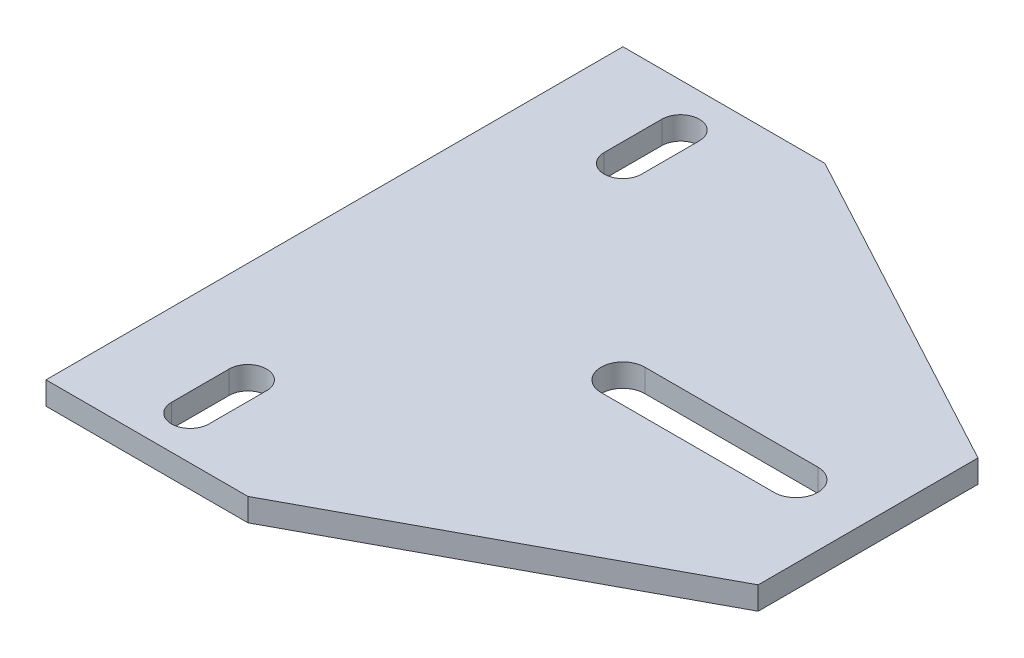
ISO-10303-21;
HEADER;
FILE_DESCRIPTION(('STEP AP214'),'2;1');
FILE_NAME('part.step','',(''),(''),'','','');
FILE_SCHEMA(('AUTOMOTIVE_DESIGN { 1 0 10303 214 1 1 1 1 }'));
ENDSEC;
DATA;
#1=APPLICATION_CONTEXT('core data for automotive mechanical design processes');
#2=APPLICATION_PROTOCOL_DEFINITION('international standard','automotive_design',2000,#1);
#3=PRODUCT_CONTEXT('',#1,'mechanical');
#4=PRODUCT('Part','Part','',(#3));
#5=PRODUCT_RELATED_PRODUCT_CATEGORY('part','',(#4));
#6=PRODUCT_DEFINITION_FORMATION('','',#4);
#7=PRODUCT_DEFINITION_CONTEXT('part definition',#1,'design');
#8=PRODUCT_DEFINITION('design','',#6,#7);
#9=PRODUCT_DEFINITION_SHAPE('','',#8);
#10=(LENGTH_UNIT() NAMED_UNIT(*) SI_UNIT(.MILLI.,.METRE.));
#11=(NAMED_UNIT(*) PLANE_ANGLE_UNIT() SI_UNIT($,.RADIAN.));
#12=(NAMED_UNIT(*) SI_UNIT($,.STERADIAN.) SOLID_ANGLE_UNIT());
#13=UNCERTAINTY_MEASURE_WITH_UNIT(LENGTH_MEASURE(1.E-05),#10,'distance_accuracy_value','');
#14=(GEOMETRIC_REPRESENTATION_CONTEXT(3) GLOBAL_UNCERTAINTY_ASSIGNED_CONTEXT((#13)) GLOBAL_UNIT_ASSIGNED_CONTEXT((#10,
#11,#12)) REPRESENTATION_CONTEXT('',''));
#15=CARTESIAN_POINT('',(0.,0.,0.));
#16=DIRECTION('',(0.,0.,1.));
#17=DIRECTION('',(1.,0.,0.));
#18=AXIS2_PLACEMENT_3D('',#15,#16,#17);
#19=CARTESIAN_POINT('',(41.5,7.9375,0.));
#20=DIRECTION('',(1.,0.,0.));
#21=DIRECTION('',(0.,0.,-1.));
#22=AXIS2_PLACEMENT_3D('',#19,#20,#21);
#23=PLANE('',#22);
#24=DIRECTION('',(0.,0.,1.));
#25=VECTOR('',#24,1.);
#26=CARTESIAN_POINT('',(41.5,0.,0.));
#27=LINE('',#26,#25);
#28=CARTESIAN_POINT('',(41.5,0.,-85.));
#29=VERTEX_POINT('',#28);
#30=CARTESIAN_POINT('',(41.5,0.,-65.));
#31=VERTEX_POINT('',#30);
#32=EDGE_CURVE('E231',#29,#31,#27,.T.);
#33=ORIENTED_EDGE('',*,*,#32,.T.);
#34=DIRECTION('',(0.,-1.,0.));
#35=VECTOR('',#34,1.);
#36=CARTESIAN_POINT('',(41.5,7.9375,-65.));
#37=LINE('',#36,#35);
#38=CARTESIAN_POINT('',(41.5,7.9375,-65.));
#39=VERTEX_POINT('',#38);
#40=EDGE_CURVE('E11',#39,#31,#37,.T.);
#41=ORIENTED_EDGE('',*,*,#40,.F.);
#42=DIRECTION('',(0.,0.,1.));
#43=VECTOR('',#42,1.);
#44=CARTESIAN_POINT('',(41.5,7.9375,0.));
#45=LINE('',#44,#43);
#46=CARTESIAN_POINT('',(41.5,7.9375,-85.));
#47=VERTEX_POINT('',#46);
#48=EDGE_CURVE('E172',#47,#39,#45,.T.);
#49=ORIENTED_EDGE('',*,*,#48,.F.);
#50=DIRECTION('',(0.,-1.,0.));
#51=VECTOR('',#50,1.);
#52=CARTESIAN_POINT('',(41.5,7.9375,-85.));
#53=LINE('',#52,#51);
#54=EDGE_CURVE('E239',#47,#29,#53,.T.);
#55=ORIENTED_EDGE('',*,*,#54,.T.);
#56=EDGE_LOOP('',(#33,#41,#49,#55));
#57=FACE_BOUND('',#56,.T.);
#58=ADVANCED_FACE('F35',(#57),#23,.F.);
#59=CARTESIAN_POINT('',(35.,7.9375,-65.));
#60=DIRECTION('',(0.,-1.,0.));
#61=DIRECTION('',(0.,0.,-1.));
#62=AXIS2_PLACEMENT_3D('',#59,#60,#61);
#63=CYLINDRICAL_SURFACE('',#62,6.49999999999997);
#64=CARTESIAN_POINT('',(35.,0.,-65.));
#65=DIRECTION('',(0.,1.,0.));
#66=DIRECTION('',(0.,0.,1.));
#67=AXIS2_PLACEMENT_3D('',#64,#65,#66);
#68=CIRCLE('',#67,6.49999999999997);
#69=CARTESIAN_POINT('',(28.5,0.,-65.));
#70=VERTEX_POINT('',#69);
#71=EDGE_CURVE('E178',#31,#70,#68,.F.);
#72=ORIENTED_EDGE('',*,*,#71,.T.);
#73=DIRECTION('',(0.,-1.,0.));
#74=VECTOR('',#73,1.);
#75=CARTESIAN_POINT('',(28.5,7.9375,-65.));
#76=LINE('',#75,#74);
#77=CARTESIAN_POINT('',(28.5,7.9375,-65.));
#78=VERTEX_POINT('',#77);
#79=EDGE_CURVE('E45',#78,#70,#76,.T.);
#80=ORIENTED_EDGE('',*,*,#79,.F.);
#81=CARTESIAN_POINT('',(35.,7.9375,-65.));
#82=DIRECTION('',(0.,1.,0.));
#83=DIRECTION('',(0.,0.,1.));
#84=AXIS2_PLACEMENT_3D('',#81,#82,#83);
#85=CIRCLE('',#84,6.49999999999997);
#86=EDGE_CURVE('E166',#39,#78,#85,.F.);
#87=ORIENTED_EDGE('',*,*,#86,.F.);
#88=ORIENTED_EDGE('',*,*,#40,.T.);
#89=EDGE_LOOP('',(#72,#80,#87,#88));
#90=FACE_BOUND('',#89,.T.);
#91=ADVANCED_FACE('F177',(#90),#63,.F.);
#92=CARTESIAN_POINT('',(28.5,7.9375,0.));
#93=DIRECTION('',(1.,0.,0.));
#94=DIRECTION('',(0.,0.,-1.));
#95=AXIS2_PLACEMENT_3D('',#92,#93,#94);
#96=PLANE('',#95);
#97=DIRECTION('',(0.,0.,1.));
#98=VECTOR('',#97,1.);
#99=CARTESIAN_POINT('',(28.5,0.,0.));
#100=LINE('',#99,#98);
#101=CARTESIAN_POINT('',(28.5,0.,-85.));
#102=VERTEX_POINT('',#101);
#103=EDGE_CURVE('E235',#102,#70,#100,.T.);
#104=ORIENTED_EDGE('',*,*,#103,.F.);
#105=DIRECTION('',(0.,-1.,0.));
#106=VECTOR('',#105,1.);
#107=CARTESIAN_POINT('',(28.5,7.9375,-85.));
#108=LINE('',#107,#106);
#109=CARTESIAN_POINT('',(28.5,7.9375,-85.));
#110=VERTEX_POINT('',#109);
#111=EDGE_CURVE('E112',#110,#102,#108,.T.);
#112=ORIENTED_EDGE('',*,*,#111,.F.);
#113=DIRECTION('',(0.,0.,1.));
#114=VECTOR('',#113,1.);
#115=CARTESIAN_POINT('',(28.5,7.9375,0.));
#116=LINE('',#115,#114);
#117=EDGE_CURVE('E170',#110,#78,#116,.T.);
#118=ORIENTED_EDGE('',*,*,#117,.T.);
#119=ORIENTED_EDGE('',*,*,#79,.T.);
#120=EDGE_LOOP('',(#104,#112,#118,#119));
#121=FACE_BOUND('',#120,.T.);
#122=ADVANCED_FACE('F183',(#121),#96,.T.);
#123=CARTESIAN_POINT('',(0.,7.9375,100.));
#124=DIRECTION('',(0.,0.,1.));
#125=DIRECTION('',(1.,0.,0.));
#126=AXIS2_PLACEMENT_3D('',#123,#124,#125);
#127=PLANE('',#126);
#128=DIRECTION('',(-1.,0.,0.));
#129=VECTOR('',#128,1.);
#130=CARTESIAN_POINT('',(0.,0.,100.));
#131=LINE('',#130,#129);
#132=CARTESIAN_POINT('',(70.,0.,100.));
#133=VERTEX_POINT('',#132);
#134=CARTESIAN_POINT('',(0.,0.,100.));
#135=VERTEX_POINT('',#134);
#136=EDGE_CURVE('E213',#133,#135,#131,.T.);
#137=ORIENTED_EDGE('',*,*,#136,.F.);
#138=DIRECTION('',(0.,-1.,0.));
#139=VECTOR('',#138,1.);
#140=CARTESIAN_POINT('',(70.,7.9375,100.));
#141=LINE('',#140,#139);
#142=CARTESIAN_POINT('',(70.,7.9375,100.));
#143=VERTEX_POINT('',#142);
#144=EDGE_CURVE('E241',#143,#133,#141,.T.);
#145=ORIENTED_EDGE('',*,*,#144,.F.);
#146=DIRECTION('',(-1.,0.,0.));
#147=VECTOR('',#146,1.);
#148=CARTESIAN_POINT('',(0.,7.9375,100.));
#149=LINE('',#148,#147);
#150=CARTESIAN_POINT('',(0.,7.9375,100.));
#151=VERTEX_POINT('',#150);
#152=EDGE_CURVE('E304',#143,#151,#149,.T.);
#153=ORIENTED_EDGE('',*,*,#152,.T.);
#154=DIRECTION('',(0.,-1.,0.));
#155=VECTOR('',#154,1.);
#156=CARTESIAN_POINT('',(0.,7.9375,100.));
#157=LINE('',#156,#155);
#158=EDGE_CURVE('E243',#151,#135,#157,.T.);
#159=ORIENTED_EDGE('',*,*,#158,.T.);
#160=EDGE_LOOP('',(#137,#145,#153,#159));
#161=FACE_BOUND('',#160,.T.);
#162=ADVANCED_FACE('F340',(#161),#127,.T.);
#163=CARTESIAN_POINT('',(57.4594072327385,7.9375,106.750110367769));
#164=DIRECTION('',(0.473962835849068,0.,0.880544848507962));
#165=DIRECTION('',(0.880544848507962,0.,-0.473962835849068));
#166=AXIS2_PLACEMENT_3D('',#163,#164,#165);
#167=PLANE('',#166);
#168=DIRECTION('',(-0.880544848507962,0.,0.473962835849068));
#169=VECTOR('',#168,1.);
#170=CARTESIAN_POINT('',(57.4594072327385,0.,106.750110367769));
#171=LINE('',#170,#169);
#172=CARTESIAN_POINT('',(185.,0.,38.1));
#173=VERTEX_POINT('',#172);
#174=EDGE_CURVE('E216',#173,#133,#171,.T.);
#175=ORIENTED_EDGE('',*,*,#174,.F.);
#176=DIRECTION('',(0.,-1.,0.));
#177=VECTOR('',#176,1.);
#178=CARTESIAN_POINT('',(185.,7.9375,38.1));
#179=LINE('',#178,#177);
#180=CARTESIAN_POINT('',(185.,7.9375,38.1));
#181=VERTEX_POINT('',#180);
#182=EDGE_CURVE('E252',#181,#173,#179,.T.);
#183=ORIENTED_EDGE('',*,*,#182,.F.);
#184=DIRECTION('',(-0.880544848507962,0.,0.473962835849068));
#185=VECTOR('',#184,1.);
#186=CARTESIAN_POINT('',(57.4594072327385,7.9375,106.750110367769));
#187=LINE('',#186,#185);
#188=EDGE_CURVE('E307',#181,#143,#187,.T.);
#189=ORIENTED_EDGE('',*,*,#188,.T.);
#190=ORIENTED_EDGE('',*,*,#144,.T.);
#191=EDGE_LOOP('',(#175,#183,#189,#190));
#192=FACE_BOUND('',#191,.T.);
#193=ADVANCED_FACE('F342',(#192),#167,.T.);
#194=CARTESIAN_POINT('',(185.,7.9375,0.));
#195=DIRECTION('',(1.,0.,0.));
#196=DIRECTION('',(0.,0.,-1.));
#197=AXIS2_PLACEMENT_3D('',#194,#195,#196);
#198=PLANE('',#197);
#199=DIRECTION('',(0.,0.,1.));
#200=VECTOR('',#199,1.);
#201=CARTESIAN_POINT('',(185.,0.,0.));
#202=LINE('',#201,#200);
#203=CARTESIAN_POINT('',(185.,0.,-38.1));
#204=VERTEX_POINT('',#203);
#205=EDGE_CURVE('E219',#204,#173,#202,.T.);
#206=ORIENTED_EDGE('',*,*,#205,.F.);
#207=DIRECTION('',(0.,-1.,0.));
#208=VECTOR('',#207,1.);
#209=CARTESIAN_POINT('',(185.,7.9375,-38.1));
#210=LINE('',#209,#208);
#211=CARTESIAN_POINT('',(185.,7.9375,-38.1));
#212=VERTEX_POINT('',#211);
#213=EDGE_CURVE('E250',#212,#204,#210,.T.);
#214=ORIENTED_EDGE('',*,*,#213,.F.);
#215=DIRECTION('',(0.,0.,1.));
#216=VECTOR('',#215,1.);
#217=CARTESIAN_POINT('',(185.,7.9375,0.));
#218=LINE('',#217,#216);
#219=EDGE_CURVE('E310',#212,#181,#218,.T.);
#220=ORIENTED_EDGE('',*,*,#219,.T.);
#221=ORIENTED_EDGE('',*,*,#182,.T.);
#222=EDGE_LOOP('',(#206,#214,#220,#221));
#223=FACE_BOUND('',#222,.T.);
#224=ADVANCED_FACE('F345',(#223),#198,.T.);
#225=CARTESIAN_POINT('',(57.4594072327385,7.9375,-106.750110367769));
#226=DIRECTION('',(0.473962835849068,0.,-0.880544848507962));
#227=DIRECTION('',(-0.880544848507962,0.,-0.473962835849068));
#228=AXIS2_PLACEMENT_3D('',#225,#226,#227);
#229=PLANE('',#228);
#230=DIRECTION('',(0.880544848507962,0.,0.473962835849068));
#231=VECTOR('',#230,1.);
#232=CARTESIAN_POINT('',(57.4594072327385,0.,-106.750110367769));
#233=LINE('',#232,#231);
#234=CARTESIAN_POINT('',(70.,0.,-100.));
#235=VERTEX_POINT('',#234);
#236=EDGE_CURVE('E222',#235,#204,#233,.T.);
#237=ORIENTED_EDGE('',*,*,#236,.F.);
#238=DIRECTION('',(0.,-1.,0.));
#239=VECTOR('',#238,1.);
#240=CARTESIAN_POINT('',(70.,7.9375,-100.));
#241=LINE('',#240,#239);
#242=CARTESIAN_POINT('',(70.,7.9375,-100.));
#243=VERTEX_POINT('',#242);
#244=EDGE_CURVE('E248',#243,#235,#241,.T.);
#245=ORIENTED_EDGE('',*,*,#244,.F.);
#246=DIRECTION('',(0.880544848507962,0.,0.473962835849068));
#247=VECTOR('',#246,1.);
#248=CARTESIAN_POINT('',(57.4594072327385,7.9375,-106.750110367769));
#249=LINE('',#248,#247);
#250=EDGE_CURVE('E313',#243,#212,#249,.T.);
#251=ORIENTED_EDGE('',*,*,#250,.T.);
#252=ORIENTED_EDGE('',*,*,#213,.T.);
#253=EDGE_LOOP('',(#237,#245,#251,#252));
#254=FACE_BOUND('',#253,.T.);
#255=ADVANCED_FACE('F347',(#254),#229,.T.);
#256=CARTESIAN_POINT('',(0.,7.9375,-100.));
#257=DIRECTION('',(0.,0.,-1.));
#258=DIRECTION('',(-1.,0.,0.));
#259=AXIS2_PLACEMENT_3D('',#256,#257,#258);
#260=PLANE('',#259);
#261=DIRECTION('',(1.,0.,0.));
#262=VECTOR('',#261,1.);
#263=CARTESIAN_POINT('',(0.,0.,-100.));
#264=LINE('',#263,#262);
#265=CARTESIAN_POINT('',(0.,0.,-100.));
#266=VERTEX_POINT('',#265);
#267=EDGE_CURVE('E225',#266,#235,#264,.T.);
#268=ORIENTED_EDGE('',*,*,#267,.F.);
#269=DIRECTION('',(0.,-1.,0.));
#270=VECTOR('',#269,1.);
#271=CARTESIAN_POINT('',(0.,7.9375,-100.));
#272=LINE('',#271,#270);
#273=CARTESIAN_POINT('',(0.,7.9375,-100.));
#274=VERTEX_POINT('',#273);
#275=EDGE_CURVE('E245',#274,#266,#272,.T.);
#276=ORIENTED_EDGE('',*,*,#275,.F.);
#277=DIRECTION('',(1.,0.,0.));
#278=VECTOR('',#277,1.);
#279=CARTESIAN_POINT('',(0.,7.9375,-100.));
#280=LINE('',#279,#278);
#281=EDGE_CURVE('E316',#274,#243,#280,.T.);
#282=ORIENTED_EDGE('',*,*,#281,.T.);
#283=ORIENTED_EDGE('',*,*,#244,.T.);
#284=EDGE_LOOP('',(#268,#276,#282,#283));
#285=FACE_BOUND('',#284,.T.);
#286=ADVANCED_FACE('F333',(#285),#260,.T.);
#287=CARTESIAN_POINT('',(160.,7.9375,0.));
#288=DIRECTION('',(0.,-1.,0.));
#289=DIRECTION('',(0.,0.,-1.));
#290=AXIS2_PLACEMENT_3D('',#287,#288,#289);
#291=CYLINDRICAL_SURFACE('',#290,7.59792299646783);
#292=CARTESIAN_POINT('',(160.,0.,0.));
#293=DIRECTION('',(0.,1.,0.));
#294=DIRECTION('',(0.,0.,1.));
#295=AXIS2_PLACEMENT_3D('',#292,#293,#294);
#296=CIRCLE('',#295,7.59792299646783);
#297=CARTESIAN_POINT('',(160.,0.,7.59792299646783));
#298=VERTEX_POINT('',#297);
#299=CARTESIAN_POINT('',(160.,0.,-7.59792299646783));
#300=VERTEX_POINT('',#299);
#301=EDGE_CURVE('E201',#298,#300,#296,.T.);
#302=ORIENTED_EDGE('',*,*,#301,.F.);
#303=DIRECTION('',(0.,-1.,0.));
#304=VECTOR('',#303,1.);
#305=CARTESIAN_POINT('',(160.,7.9375,7.59792299646783));
#306=LINE('',#305,#304);
#307=CARTESIAN_POINT('',(160.,7.9375,7.59792299646783));
#308=VERTEX_POINT('',#307);
#309=EDGE_CURVE('E246',#308,#298,#306,.T.);
#310=ORIENTED_EDGE('',*,*,#309,.F.);
#311=CARTESIAN_POINT('',(160.,7.9375,0.));
#312=DIRECTION('',(0.,1.,0.));
#313=DIRECTION('',(0.,0.,1.));
#314=AXIS2_PLACEMENT_3D('',#311,#312,#313);
#315=CIRCLE('',#314,7.59792299646783);
#316=CARTESIAN_POINT('',(160.,7.9375,-7.59792299646783));
#317=VERTEX_POINT('',#316);
#318=EDGE_CURVE('E287',#308,#317,#315,.T.);
#319=ORIENTED_EDGE('',*,*,#318,.T.);
#320=DIRECTION('',(0.,-1.,0.));
#321=VECTOR('',#320,1.);
#322=CARTESIAN_POINT('',(160.,7.9375,-7.59792299646783));
#323=LINE('',#322,#321);
#324=EDGE_CURVE('E255',#317,#300,#323,.T.);
#325=ORIENTED_EDGE('',*,*,#324,.T.);
#326=EDGE_LOOP('',(#302,#310,#319,#325));
#327=FACE_BOUND('',#326,.T.);
#328=ADVANCED_FACE('F354',(#327),#291,.F.);
#329=CARTESIAN_POINT('',(0.,7.9375,7.59792299646783));
#330=DIRECTION('',(0.,0.,-1.));
#331=DIRECTION('',(-1.,0.,0.));
#332=AXIS2_PLACEMENT_3D('',#329,#330,#331);
#333=PLANE('',#332);
#334=DIRECTION('',(1.,0.,0.));
#335=VECTOR('',#334,1.);
#336=CARTESIAN_POINT('',(0.,0.,7.59792299646783));
#337=LINE('',#336,#335);
#338=CARTESIAN_POINT('',(100.,0.,7.59792299646783));
#339=VERTEX_POINT('',#338);
#340=EDGE_CURVE('E204',#339,#298,#337,.T.);
#341=ORIENTED_EDGE('',*,*,#340,.F.);
#342=DIRECTION('',(0.,-1.,0.));
#343=VECTOR('',#342,1.);
#344=CARTESIAN_POINT('',(100.,7.9375,7.59792299646783));
#345=LINE('',#344,#343);
#346=CARTESIAN_POINT('',(100.,7.9375,7.59792299646783));
#347=VERTEX_POINT('',#346);
#348=EDGE_CURVE('E259',#347,#339,#345,.T.);
#349=ORIENTED_EDGE('',*,*,#348,.F.);
#350=DIRECTION('',(1.,0.,0.));
#351=VECTOR('',#350,1.);
#352=CARTESIAN_POINT('',(0.,7.9375,7.59792299646783));
#353=LINE('',#352,#351);
#354=EDGE_CURVE('E296',#347,#308,#353,.T.);
#355=ORIENTED_EDGE('',*,*,#354,.T.);
#356=ORIENTED_EDGE('',*,*,#309,.T.);
#357=EDGE_LOOP('',(#341,#349,#355,#356));
#358=FACE_BOUND('',#357,.T.);
#359=ADVANCED_FACE('F384',(#358),#333,.T.);
#360=CARTESIAN_POINT('',(100.,7.9375,0.));
#361=DIRECTION('',(0.,-1.,0.));
#362=DIRECTION('',(0.,0.,-1.));
#363=AXIS2_PLACEMENT_3D('',#360,#361,#362);
#364=CYLINDRICAL_SURFACE('',#363,7.59792299646783);
#365=CARTESIAN_POINT('',(100.,0.,0.));
#366=DIRECTION('',(0.,1.,0.));
#367=DIRECTION('',(0.,0.,1.));
#368=AXIS2_PLACEMENT_3D('',#365,#366,#367);
#369=CIRCLE('',#368,7.59792299646783);
#370=CARTESIAN_POINT('',(100.,0.,-7.59792299646783));
#371=VERTEX_POINT('',#370);
#372=EDGE_CURVE('E207',#371,#339,#369,.T.);
#373=ORIENTED_EDGE('',*,*,#372,.F.);
#374=DIRECTION('',(0.,-1.,0.));
#375=VECTOR('',#374,1.);
#376=CARTESIAN_POINT('',(100.,7.9375,-7.59792299646783));
#377=LINE('',#376,#375);
#378=CARTESIAN_POINT('',(100.,7.9375,-7.59792299646783));
#379=VERTEX_POINT('',#378);
#380=EDGE_CURVE('E257',#379,#371,#377,.T.);
#381=ORIENTED_EDGE('',*,*,#380,.F.);
#382=CARTESIAN_POINT('',(100.,7.9375,0.));
#383=DIRECTION('',(0.,1.,0.));
#384=DIRECTION('',(0.,0.,1.));
#385=AXIS2_PLACEMENT_3D('',#382,#383,#384);
#386=CIRCLE('',#385,7.59792299646783);
#387=EDGE_CURVE('E299',#379,#347,#386,.T.);
#388=ORIENTED_EDGE('',*,*,#387,.T.);
#389=ORIENTED_EDGE('',*,*,#348,.T.);
#390=EDGE_LOOP('',(#373,#381,#388,#389));
#391=FACE_BOUND('',#390,.T.);
#392=ADVANCED_FACE('F388',(#391),#364,.F.);
#393=CARTESIAN_POINT('',(35.,7.9375,65.));
#394=DIRECTION('',(0.,-1.,0.));
#395=DIRECTION('',(0.,0.,-1.));
#396=AXIS2_PLACEMENT_3D('',#393,#394,#395);
#397=CYLINDRICAL_SURFACE('',#396,6.49999999999997);
#398=CARTESIAN_POINT('',(35.,0.,65.));
#399=DIRECTION('',(0.,1.,0.));
#400=DIRECTION('',(0.,0.,1.));
#401=AXIS2_PLACEMENT_3D('',#398,#399,#400);
#402=CIRCLE('',#401,6.49999999999997);
#403=CARTESIAN_POINT('',(41.5,0.,65.));
#404=VERTEX_POINT('',#403);
#405=CARTESIAN_POINT('',(28.5,0.,65.));
#406=VERTEX_POINT('',#405);
#407=EDGE_CURVE('E189',#404,#406,#402,.T.);
#408=ORIENTED_EDGE('',*,*,#407,.F.);
#409=DIRECTION('',(0.,-1.,0.));
#410=VECTOR('',#409,1.);
#411=CARTESIAN_POINT('',(41.5,7.9375,65.));
#412=LINE('',#411,#410);
#413=CARTESIAN_POINT('',(41.5,7.9375,65.));
#414=VERTEX_POINT('',#413);
#415=EDGE_CURVE('E39',#414,#404,#412,.T.);
#416=ORIENTED_EDGE('',*,*,#415,.F.);
#417=CARTESIAN_POINT('',(35.,7.9375,65.));
#418=DIRECTION('',(0.,1.,0.));
#419=DIRECTION('',(0.,0.,1.));
#420=AXIS2_PLACEMENT_3D('',#417,#418,#419);
#421=CIRCLE('',#420,6.49999999999997);
#422=CARTESIAN_POINT('',(28.5,7.9375,65.));
#423=VERTEX_POINT('',#422);
#424=EDGE_CURVE('E238',#414,#423,#421,.T.);
#425=ORIENTED_EDGE('',*,*,#424,.T.);
#426=DIRECTION('',(0.,-1.,0.));
#427=VECTOR('',#426,1.);
#428=CARTESIAN_POINT('',(28.5,7.9375,65.));
#429=LINE('',#428,#427);
#430=EDGE_CURVE('E185',#423,#406,#429,.T.);
#431=ORIENTED_EDGE('',*,*,#430,.T.);
#432=EDGE_LOOP('',(#408,#416,#425,#431));
#433=FACE_BOUND('',#432,.T.);
#434=ADVANCED_FACE('F37',(#433),#397,.F.);
#435=CARTESIAN_POINT('',(41.5,7.9375,0.));
#436=DIRECTION('',(-1.,0.,0.));
#437=DIRECTION('',(0.,0.,1.));
#438=AXIS2_PLACEMENT_3D('',#435,#436,#437);
#439=PLANE('',#438);
#440=DIRECTION('',(0.,0.,-1.));
#441=VECTOR('',#440,1.);
#442=CARTESIAN_POINT('',(41.5,0.,0.));
#443=LINE('',#442,#441);
#444=CARTESIAN_POINT('',(41.5,0.,85.));
#445=VERTEX_POINT('',#444);
#446=EDGE_CURVE('E192',#445,#404,#443,.T.);
#447=ORIENTED_EDGE('',*,*,#446,.F.);
#448=DIRECTION('',(0.,-1.,0.));
#449=VECTOR('',#448,1.);
#450=CARTESIAN_POINT('',(41.5,7.9375,85.));
#451=LINE('',#450,#449);
#452=CARTESIAN_POINT('',(41.5,7.9375,85.));
#453=VERTEX_POINT('',#452);
#454=EDGE_CURVE('E264',#453,#445,#451,.T.);
#455=ORIENTED_EDGE('',*,*,#454,.F.);
#456=DIRECTION('',(0.,0.,-1.));
#457=VECTOR('',#456,1.);
#458=CARTESIAN_POINT('',(41.5,7.9375,0.));
#459=LINE('',#458,#457);
#460=EDGE_CURVE('E273',#453,#414,#459,.T.);
#461=ORIENTED_EDGE('',*,*,#460,.T.);
#462=ORIENTED_EDGE('',*,*,#415,.T.);
#463=EDGE_LOOP('',(#447,#455,#461,#462));
#464=FACE_BOUND('',#463,.T.);
#465=ADVANCED_FACE('F271',(#464),#439,.T.);
#466=CARTESIAN_POINT('',(35.,7.9375,85.));
#467=DIRECTION('',(0.,-1.,0.));
#468=DIRECTION('',(0.,0.,-1.));
#469=AXIS2_PLACEMENT_3D('',#466,#467,#468);
#470=CYLINDRICAL_SURFACE('',#469,6.49999999999996);
#471=CARTESIAN_POINT('',(35.,0.,85.));
#472=DIRECTION('',(0.,1.,0.));
#473=DIRECTION('',(0.,0.,1.));
#474=AXIS2_PLACEMENT_3D('',#471,#472,#473);
#475=CIRCLE('',#474,6.49999999999996);
#476=CARTESIAN_POINT('',(28.5,0.,85.));
#477=VERTEX_POINT('',#476);
#478=EDGE_CURVE('E195',#477,#445,#475,.T.);
#479=ORIENTED_EDGE('',*,*,#478,.F.);
#480=DIRECTION('',(0.,-1.,0.));
#481=VECTOR('',#480,1.);
#482=CARTESIAN_POINT('',(28.5,7.9375,85.));
#483=LINE('',#482,#481);
#484=CARTESIAN_POINT('',(28.5,7.9375,85.));
#485=VERTEX_POINT('',#484);
#486=EDGE_CURVE('E263',#485,#477,#483,.T.);
#487=ORIENTED_EDGE('',*,*,#486,.F.);
#488=CARTESIAN_POINT('',(35.,7.9375,85.));
#489=DIRECTION('',(0.,1.,0.));
#490=DIRECTION('',(0.,0.,1.));
#491=AXIS2_PLACEMENT_3D('',#488,#489,#490);
#492=CIRCLE('',#491,6.49999999999996);
#493=EDGE_CURVE('E282',#485,#453,#492,.T.);
#494=ORIENTED_EDGE('',*,*,#493,.T.);
#495=ORIENTED_EDGE('',*,*,#454,.T.);
#496=EDGE_LOOP('',(#479,#487,#494,#495));
#497=FACE_BOUND('',#496,.T.);
#498=ADVANCED_FACE('F279',(#497),#470,.F.);
#499=CARTESIAN_POINT('',(0.,7.9375,0.));
#500=DIRECTION('',(-1.,0.,0.));
#501=DIRECTION('',(0.,0.,1.));
#502=AXIS2_PLACEMENT_3D('',#499,#500,#501);
#503=PLANE('',#502);
#504=DIRECTION('',(0.,0.,-1.));
#505=VECTOR('',#504,1.);
#506=CARTESIAN_POINT('',(0.,0.,0.));
#507=LINE('',#506,#505);
#508=EDGE_CURVE('E228',#135,#266,#507,.T.);
#509=ORIENTED_EDGE('',*,*,#508,.F.);
#510=ORIENTED_EDGE('',*,*,#158,.F.);
#511=DIRECTION('',(0.,0.,-1.));
#512=VECTOR('',#511,1.);
#513=CARTESIAN_POINT('',(0.,7.9375,0.));
#514=LINE('',#513,#512);
#515=EDGE_CURVE('E319',#151,#274,#514,.T.);
#516=ORIENTED_EDGE('',*,*,#515,.T.);
#517=ORIENTED_EDGE('',*,*,#275,.T.);
#518=EDGE_LOOP('',(#509,#510,#516,#517));
#519=FACE_BOUND('',#518,.T.);
#520=ADVANCED_FACE('F324',(#519),#503,.T.);
#521=CARTESIAN_POINT('',(0.,7.9375,-7.59792299646783));
#522=DIRECTION('',(0.,0.,-1.));
#523=DIRECTION('',(-1.,0.,0.));
#524=AXIS2_PLACEMENT_3D('',#521,#522,#523);
#525=PLANE('',#524);
#526=DIRECTION('',(1.,0.,0.));
#527=VECTOR('',#526,1.);
#528=CARTESIAN_POINT('',(0.,0.,-7.59792299646783));
#529=LINE('',#528,#527);
#530=EDGE_CURVE('E210',#371,#300,#529,.T.);
#531=ORIENTED_EDGE('',*,*,#530,.T.);
#532=ORIENTED_EDGE('',*,*,#324,.F.);
#533=DIRECTION('',(1.,0.,0.));
#534=VECTOR('',#533,1.);
#535=CARTESIAN_POINT('',(0.,7.9375,-7.59792299646783));
#536=LINE('',#535,#534);
#537=EDGE_CURVE('E302',#379,#317,#536,.T.);
#538=ORIENTED_EDGE('',*,*,#537,.F.);
#539=ORIENTED_EDGE('',*,*,#380,.T.);
#540=EDGE_LOOP('',(#531,#532,#538,#539));
#541=FACE_BOUND('',#540,.T.);
#542=ADVANCED_FACE('F367',(#541),#525,.F.);
#543=CARTESIAN_POINT('',(28.5,7.9375,0.));
#544=DIRECTION('',(-1.,0.,0.));
#545=DIRECTION('',(0.,0.,1.));
#546=AXIS2_PLACEMENT_3D('',#543,#544,#545);
#547=PLANE('',#546);
#548=DIRECTION('',(0.,0.,-1.));
#549=VECTOR('',#548,1.);
#550=CARTESIAN_POINT('',(28.5,0.,0.));
#551=LINE('',#550,#549);
#552=EDGE_CURVE('E198',#477,#406,#551,.T.);
#553=ORIENTED_EDGE('',*,*,#552,.T.);
#554=ORIENTED_EDGE('',*,*,#430,.F.);
#555=DIRECTION('',(0.,0.,-1.));
#556=VECTOR('',#555,1.);
#557=CARTESIAN_POINT('',(28.5,7.9375,0.));
#558=LINE('',#557,#556);
#559=EDGE_CURVE('E284',#485,#423,#558,.T.);
#560=ORIENTED_EDGE('',*,*,#559,.F.);
#561=ORIENTED_EDGE('',*,*,#486,.T.);
#562=EDGE_LOOP('',(#553,#554,#560,#561));
#563=FACE_BOUND('',#562,.T.);
#564=ADVANCED_FACE('F285',(#563),#547,.F.);
#565=CARTESIAN_POINT('',(35.,7.9375,-85.));
#566=DIRECTION('',(0.,-1.,0.));
#567=DIRECTION('',(0.,0.,-1.));
#568=AXIS2_PLACEMENT_3D('',#565,#566,#567);
#569=CYLINDRICAL_SURFACE('',#568,6.49999999999996);
#570=CARTESIAN_POINT('',(35.,0.,-85.));
#571=DIRECTION('',(0.,1.,0.));
#572=DIRECTION('',(0.,0.,1.));
#573=AXIS2_PLACEMENT_3D('',#570,#571,#572);
#574=CIRCLE('',#573,6.49999999999996);
#575=EDGE_CURVE('E115',#102,#29,#574,.F.);
#576=ORIENTED_EDGE('',*,*,#575,.T.);
#577=ORIENTED_EDGE('',*,*,#54,.F.);
#578=CARTESIAN_POINT('',(35.,7.9375,-85.));
#579=DIRECTION('',(0.,1.,0.));
#580=DIRECTION('',(0.,0.,1.));
#581=AXIS2_PLACEMENT_3D('',#578,#579,#580);
#582=CIRCLE('',#581,6.49999999999996);
#583=EDGE_CURVE('E54',#110,#47,#582,.F.);
#584=ORIENTED_EDGE('',*,*,#583,.F.);
#585=ORIENTED_EDGE('',*,*,#111,.T.);
#586=EDGE_LOOP('',(#576,#577,#584,#585));
#587=FACE_BOUND('',#586,.T.);
#588=ADVANCED_FACE('F381',(#587),#569,.F.);
#589=CARTESIAN_POINT('',(0.,7.9375,0.));
#590=DIRECTION('',(0.,1.,0.));
#591=DIRECTION('',(0.,0.,1.));
#592=AXIS2_PLACEMENT_3D('',#589,#590,#591);
#593=PLANE('',#592);
#594=ORIENTED_EDGE('',*,*,#424,.F.);
#595=ORIENTED_EDGE('',*,*,#460,.F.);
#596=ORIENTED_EDGE('',*,*,#493,.F.);
#597=ORIENTED_EDGE('',*,*,#559,.T.);
#598=EDGE_LOOP('',(#594,#595,#596,#597));
#599=FACE_BOUND('',#598,.T.);
#600=ORIENTED_EDGE('',*,*,#318,.F.);
#601=ORIENTED_EDGE('',*,*,#354,.F.);
#602=ORIENTED_EDGE('',*,*,#387,.F.);
#603=ORIENTED_EDGE('',*,*,#537,.T.);
#604=EDGE_LOOP('',(#600,#601,#602,#603));
#605=FACE_BOUND('',#604,.T.);
#606=ORIENTED_EDGE('',*,*,#152,.F.);
#607=ORIENTED_EDGE('',*,*,#188,.F.);
#608=ORIENTED_EDGE('',*,*,#219,.F.);
#609=ORIENTED_EDGE('',*,*,#250,.F.);
#610=ORIENTED_EDGE('',*,*,#281,.F.);
#611=ORIENTED_EDGE('',*,*,#515,.F.);
#612=EDGE_LOOP('',(#606,#607,#608,#609,#610,#611));
#613=FACE_BOUND('',#612,.T.);
#614=ORIENTED_EDGE('',*,*,#48,.T.);
#615=ORIENTED_EDGE('',*,*,#86,.T.);
#616=ORIENTED_EDGE('',*,*,#117,.F.);
#617=ORIENTED_EDGE('',*,*,#583,.T.);
#618=EDGE_LOOP('',(#614,#615,#616,#617));
#619=FACE_BOUND('',#618,.T.);
#620=ADVANCED_FACE('F168',(#599,#605,#613,#619),#593,.T.);
#621=CARTESIAN_POINT('',(0.,0.,0.));
#622=DIRECTION('',(0.,1.,0.));
#623=DIRECTION('',(0.,0.,1.));
#624=AXIS2_PLACEMENT_3D('',#621,#622,#623);
#625=PLANE('',#624);
#626=ORIENTED_EDGE('',*,*,#407,.T.);
#627=ORIENTED_EDGE('',*,*,#552,.F.);
#628=ORIENTED_EDGE('',*,*,#478,.T.);
#629=ORIENTED_EDGE('',*,*,#446,.T.);
#630=EDGE_LOOP('',(#626,#627,#628,#629));
#631=FACE_BOUND('',#630,.T.);
#632=ORIENTED_EDGE('',*,*,#301,.T.);
#633=ORIENTED_EDGE('',*,*,#530,.F.);
#634=ORIENTED_EDGE('',*,*,#372,.T.);
#635=ORIENTED_EDGE('',*,*,#340,.T.);
#636=EDGE_LOOP('',(#632,#633,#634,#635));
#637=FACE_BOUND('',#636,.T.);
#638=ORIENTED_EDGE('',*,*,#136,.T.);
#639=ORIENTED_EDGE('',*,*,#508,.T.);
#640=ORIENTED_EDGE('',*,*,#267,.T.);
#641=ORIENTED_EDGE('',*,*,#236,.T.);
#642=ORIENTED_EDGE('',*,*,#205,.T.);
#643=ORIENTED_EDGE('',*,*,#174,.T.);
#644=EDGE_LOOP('',(#638,#639,#640,#641,#642,#643));
#645=FACE_BOUND('',#644,.T.);
#646=ORIENTED_EDGE('',*,*,#32,.F.);
#647=ORIENTED_EDGE('',*,*,#575,.F.);
#648=ORIENTED_EDGE('',*,*,#103,.T.);
#649=ORIENTED_EDGE('',*,*,#71,.F.);
#650=EDGE_LOOP('',(#646,#647,#648,#649));
#651=FACE_BOUND('',#650,.T.);
#652=ADVANCED_FACE('F277',(#631,#637,#645,#651),#625,.F.);
#653=CLOSED_SHELL('',(#58,#91,#122,#162,#193,#224,#255,#286,#328,#359,#392,#434,#465,#498,#520,
#542,#564,#588,#620,#652));
#654=MANIFOLD_SOLID_BREP('B2',#653);
#655=ADVANCED_BREP_SHAPE_REPRESENTATION('',(#18,#654),#14);
#656=SHAPE_DEFINITION_REPRESENTATION(#9,#655);
ENDSEC;
END-ISO-10303-21;
